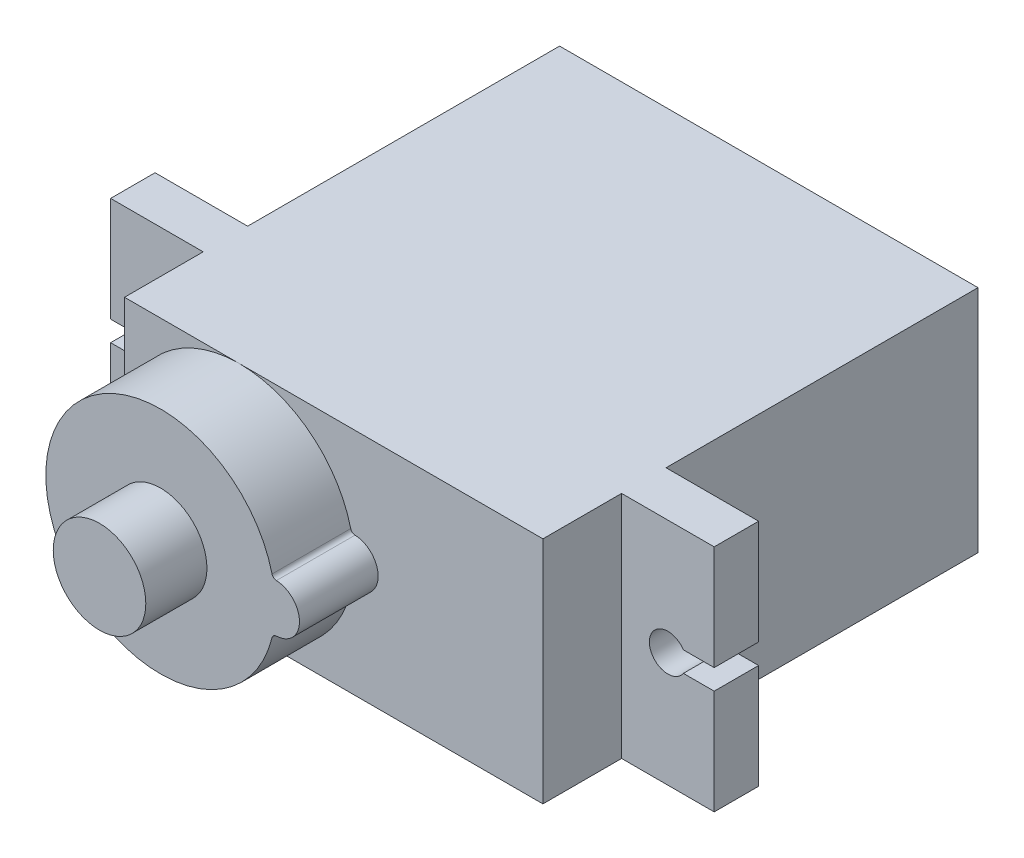
ISO-10303-21;
HEADER;
FILE_DESCRIPTION(('STEP AP214'),'2;1');
FILE_NAME('part.step','',(''),(''),'','','');
FILE_SCHEMA(('AUTOMOTIVE_DESIGN { 1 0 10303 214 1 1 1 1 }'));
ENDSEC;
DATA;
#1=APPLICATION_CONTEXT('core data for automotive mechanical design processes');
#2=APPLICATION_PROTOCOL_DEFINITION('international standard','automotive_design',2000,#1);
#3=PRODUCT_CONTEXT('',#1,'mechanical');
#4=PRODUCT('Part','Part','',(#3));
#5=PRODUCT_RELATED_PRODUCT_CATEGORY('part','',(#4));
#6=PRODUCT_DEFINITION_FORMATION('','',#4);
#7=PRODUCT_DEFINITION_CONTEXT('part definition',#1,'design');
#8=PRODUCT_DEFINITION('design','',#6,#7);
#9=PRODUCT_DEFINITION_SHAPE('','',#8);
#10=(LENGTH_UNIT() NAMED_UNIT(*) SI_UNIT(.MILLI.,.METRE.));
#11=(NAMED_UNIT(*) PLANE_ANGLE_UNIT() SI_UNIT($,.RADIAN.));
#12=(NAMED_UNIT(*) SI_UNIT($,.STERADIAN.) SOLID_ANGLE_UNIT());
#13=UNCERTAINTY_MEASURE_WITH_UNIT(LENGTH_MEASURE(1.E-05),#10,'distance_accuracy_value','');
#14=(GEOMETRIC_REPRESENTATION_CONTEXT(3) GLOBAL_UNCERTAINTY_ASSIGNED_CONTEXT((#13)) GLOBAL_UNIT_ASSIGNED_CONTEXT((#10,
#11,#12)) REPRESENTATION_CONTEXT('',''));
#15=CARTESIAN_POINT('',(0.,0.,0.));
#16=DIRECTION('',(0.,0.,1.));
#17=DIRECTION('',(1.,0.,0.));
#18=AXIS2_PLACEMENT_3D('',#15,#16,#17);
#19=CARTESIAN_POINT('',(0.,0.,23.5));
#20=DIRECTION('',(0.,0.,1.));
#21=DIRECTION('',(1.,0.,0.));
#22=AXIS2_PLACEMENT_3D('',#19,#20,#21);
#23=PLANE('',#22);
#24=CARTESIAN_POINT('',(1.16129032258064,1.54878775058365,23.5));
#25=DIRECTION('',(0.,0.,-1.));
#26=DIRECTION('',(-1.,0.,0.));
#27=AXIS2_PLACEMENT_3D('',#24,#25,#26);
#28=CIRCLE('',#27,0.25);
#29=CARTESIAN_POINT('',(1.15140478668054,1.29898327468306,23.5));
#30=VERTEX_POINT('',#29);
#31=CARTESIAN_POINT('',(0.918604651162786,1.48875721761529,23.5));
#32=VERTEX_POINT('',#31);
#33=EDGE_CURVE('E58',#30,#32,#28,.T.);
#34=ORIENTED_EDGE('',*,*,#33,.F.);
#35=CARTESIAN_POINT('',(1.1,0.,23.5));
#36=DIRECTION('',(0.,0.,1.));
#37=DIRECTION('',(1.,0.,0.));
#38=AXIS2_PLACEMENT_3D('',#35,#36,#37);
#39=CIRCLE('',#38,1.3);
#40=CARTESIAN_POINT('',(1.15140478668054,-1.29898327468306,23.5));
#41=VERTEX_POINT('',#40);
#42=EDGE_CURVE('E63',#41,#30,#39,.T.);
#43=ORIENTED_EDGE('',*,*,#42,.F.);
#44=CARTESIAN_POINT('',(1.16129032258064,-1.54878775058365,23.5));
#45=DIRECTION('',(0.,0.,1.));
#46=DIRECTION('',(1.,0.,0.));
#47=AXIS2_PLACEMENT_3D('',#44,#45,#46);
#48=CIRCLE('',#47,0.25);
#49=CARTESIAN_POINT('',(0.918604651162786,-1.48875721761529,23.5));
#50=VERTEX_POINT('',#49);
#51=EDGE_CURVE('E398',#41,#50,#48,.T.);
#52=ORIENTED_EDGE('',*,*,#51,.T.);
#53=CARTESIAN_POINT('',(-5.1,0.,23.5));
#54=DIRECTION('',(0.,0.,1.));
#55=DIRECTION('',(1.,0.,0.));
#56=AXIS2_PLACEMENT_3D('',#53,#54,#55);
#57=CIRCLE('',#56,6.2);
#58=CARTESIAN_POINT('',(-5.1,-6.2,23.5));
#59=VERTEX_POINT('',#58);
#60=EDGE_CURVE('E384',#59,#50,#57,.T.);
#61=ORIENTED_EDGE('',*,*,#60,.F.);
#62=DIRECTION('',(1.,0.,0.));
#63=VECTOR('',#62,1.);
#64=CARTESIAN_POINT('',(11.3,-6.2,23.5));
#65=LINE('',#64,#63);
#66=CARTESIAN_POINT('',(11.3,-6.2,23.5));
#67=VERTEX_POINT('',#66);
#68=EDGE_CURVE('E342',#59,#67,#65,.T.);
#69=ORIENTED_EDGE('',*,*,#68,.T.);
#70=DIRECTION('',(0.,1.,0.));
#71=VECTOR('',#70,1.);
#72=CARTESIAN_POINT('',(11.3,-6.2,23.5));
#73=LINE('',#72,#71);
#74=CARTESIAN_POINT('',(11.3,6.2,23.5));
#75=VERTEX_POINT('',#74);
#76=EDGE_CURVE('E349',#67,#75,#73,.T.);
#77=ORIENTED_EDGE('',*,*,#76,.T.);
#78=DIRECTION('',(-1.,0.,0.));
#79=VECTOR('',#78,1.);
#80=CARTESIAN_POINT('',(11.3,6.2,23.5));
#81=LINE('',#80,#79);
#82=CARTESIAN_POINT('',(-5.1,6.2,23.5));
#83=VERTEX_POINT('',#82);
#84=EDGE_CURVE('E355',#75,#83,#81,.T.);
#85=ORIENTED_EDGE('',*,*,#84,.T.);
#86=EDGE_CURVE('E395',#32,#83,#57,.T.);
#87=ORIENTED_EDGE('',*,*,#86,.F.);
#88=EDGE_LOOP('',(#34,#43,#52,#61,#69,#77,#85,#87));
#89=FACE_BOUND('',#88,.T.);
#90=ADVANCED_FACE('F44',(#89),#23,.T.);
#91=CARTESIAN_POINT('',(-11.3,0.,23.5));
#92=VERTEX_POINT('',#91);
#93=EDGE_CURVE('E52',#83,#92,#57,.T.);
#94=ORIENTED_EDGE('',*,*,#93,.F.);
#95=CARTESIAN_POINT('',(-11.3,6.2,23.5));
#96=VERTEX_POINT('',#95);
#97=EDGE_CURVE('E351',#83,#96,#81,.T.);
#98=ORIENTED_EDGE('',*,*,#97,.T.);
#99=DIRECTION('',(0.,-1.,0.));
#100=VECTOR('',#99,1.);
#101=CARTESIAN_POINT('',(-11.3,-6.2,23.5));
#102=LINE('',#101,#100);
#103=EDGE_CURVE('E343',#96,#92,#102,.T.);
#104=ORIENTED_EDGE('',*,*,#103,.T.);
#105=EDGE_LOOP('',(#94,#98,#104));
#106=FACE_BOUND('',#105,.T.);
#107=ADVANCED_FACE('F402',(#106),#23,.T.);
#108=CARTESIAN_POINT('',(16.3,11.7461698495448,16.85));
#109=DIRECTION('',(1.,0.,0.));
#110=DIRECTION('',(0.,1.,0.));
#111=AXIS2_PLACEMENT_3D('',#108,#109,#110);
#112=PLANE('',#111);
#113=DIRECTION('',(0.,0.,1.));
#114=VECTOR('',#113,1.);
#115=CARTESIAN_POINT('',(16.3,0.55,0.));
#116=LINE('',#115,#114);
#117=CARTESIAN_POINT('',(16.3,0.55,16.85));
#118=VERTEX_POINT('',#117);
#119=CARTESIAN_POINT('',(16.3,0.55,19.25));
#120=VERTEX_POINT('',#119);
#121=EDGE_CURVE('E258',#118,#120,#116,.T.);
#122=ORIENTED_EDGE('',*,*,#121,.F.);
#123=DIRECTION('',(0.,-1.,0.));
#124=VECTOR('',#123,1.);
#125=CARTESIAN_POINT('',(16.3,11.7461698495448,16.85));
#126=LINE('',#125,#124);
#127=CARTESIAN_POINT('',(16.3,6.2,16.85));
#128=VERTEX_POINT('',#127);
#129=EDGE_CURVE('E334',#128,#118,#126,.T.);
#130=ORIENTED_EDGE('',*,*,#129,.F.);
#131=DIRECTION('',(0.,0.,-1.));
#132=VECTOR('',#131,1.);
#133=CARTESIAN_POINT('',(16.3,6.2,16.85));
#134=LINE('',#133,#132);
#135=CARTESIAN_POINT('',(16.3,6.2,19.25));
#136=VERTEX_POINT('',#135);
#137=EDGE_CURVE('E315',#136,#128,#134,.T.);
#138=ORIENTED_EDGE('',*,*,#137,.F.);
#139=DIRECTION('',(0.,-1.,0.));
#140=VECTOR('',#139,1.);
#141=CARTESIAN_POINT('',(16.3,11.7461698495448,19.25));
#142=LINE('',#141,#140);
#143=EDGE_CURVE('E328',#136,#120,#142,.T.);
#144=ORIENTED_EDGE('',*,*,#143,.T.);
#145=EDGE_LOOP('',(#122,#130,#138,#144));
#146=FACE_BOUND('',#145,.T.);
#147=ADVANCED_FACE('F425',(#146),#112,.T.);
#148=CARTESIAN_POINT('',(-16.3,11.7461698495448,16.85));
#149=DIRECTION('',(-1.,0.,0.));
#150=DIRECTION('',(0.,-1.,0.));
#151=AXIS2_PLACEMENT_3D('',#148,#149,#150);
#152=PLANE('',#151);
#153=DIRECTION('',(0.,0.,1.));
#154=VECTOR('',#153,1.);
#155=CARTESIAN_POINT('',(-16.3,0.55,0.));
#156=LINE('',#155,#154);
#157=CARTESIAN_POINT('',(-16.3,0.55,16.85));
#158=VERTEX_POINT('',#157);
#159=CARTESIAN_POINT('',(-16.3,0.55,19.25));
#160=VERTEX_POINT('',#159);
#161=EDGE_CURVE('E249',#158,#160,#156,.T.);
#162=ORIENTED_EDGE('',*,*,#161,.T.);
#163=DIRECTION('',(0.,-1.,0.));
#164=VECTOR('',#163,1.);
#165=CARTESIAN_POINT('',(-16.3,11.7461698495448,19.25));
#166=LINE('',#165,#164);
#167=CARTESIAN_POINT('',(-16.3,6.2,19.25));
#168=VERTEX_POINT('',#167);
#169=EDGE_CURVE('E302',#168,#160,#166,.T.);
#170=ORIENTED_EDGE('',*,*,#169,.F.);
#171=DIRECTION('',(0.,0.,1.));
#172=VECTOR('',#171,1.);
#173=CARTESIAN_POINT('',(-16.3,6.2,16.85));
#174=LINE('',#173,#172);
#175=CARTESIAN_POINT('',(-16.3,6.2,16.85));
#176=VERTEX_POINT('',#175);
#177=EDGE_CURVE('E282',#176,#168,#174,.T.);
#178=ORIENTED_EDGE('',*,*,#177,.F.);
#179=DIRECTION('',(0.,-1.,0.));
#180=VECTOR('',#179,1.);
#181=CARTESIAN_POINT('',(-16.3,11.7461698495448,16.85));
#182=LINE('',#181,#180);
#183=EDGE_CURVE('E299',#176,#158,#182,.T.);
#184=ORIENTED_EDGE('',*,*,#183,.T.);
#185=EDGE_LOOP('',(#162,#170,#178,#184));
#186=FACE_BOUND('',#185,.T.);
#187=ADVANCED_FACE('F453',(#186),#152,.T.);
#188=CARTESIAN_POINT('',(-11.3,-6.2,23.5));
#189=DIRECTION('',(1.,0.,0.));
#190=DIRECTION('',(0.,0.,-1.));
#191=AXIS2_PLACEMENT_3D('',#188,#189,#190);
#192=PLANE('',#191);
#193=DIRECTION('',(0.,-1.,0.));
#194=VECTOR('',#193,1.);
#195=CARTESIAN_POINT('',(-11.3,11.7461698495448,16.85));
#196=LINE('',#195,#194);
#197=CARTESIAN_POINT('',(-11.3,6.2,16.85));
#198=VERTEX_POINT('',#197);
#199=CARTESIAN_POINT('',(-11.3,-6.2,16.85));
#200=VERTEX_POINT('',#199);
#201=EDGE_CURVE('E288',#198,#200,#196,.T.);
#202=ORIENTED_EDGE('',*,*,#201,.F.);
#203=DIRECTION('',(0.,0.,-1.));
#204=VECTOR('',#203,1.);
#205=CARTESIAN_POINT('',(-11.3,6.2,23.5));
#206=LINE('',#205,#204);
#207=CARTESIAN_POINT('',(-11.3,6.2,0.));
#208=VERTEX_POINT('',#207);
#209=EDGE_CURVE('E354',#198,#208,#206,.T.);
#210=ORIENTED_EDGE('',*,*,#209,.T.);
#211=DIRECTION('',(0.,-1.,0.));
#212=VECTOR('',#211,1.);
#213=CARTESIAN_POINT('',(-11.3,-6.2,0.));
#214=LINE('',#213,#212);
#215=CARTESIAN_POINT('',(-11.3,-6.2,0.));
#216=VERTEX_POINT('',#215);
#217=EDGE_CURVE('E339',#208,#216,#214,.T.);
#218=ORIENTED_EDGE('',*,*,#217,.T.);
#219=DIRECTION('',(0.,0.,-1.));
#220=VECTOR('',#219,1.);
#221=CARTESIAN_POINT('',(-11.3,-6.2,23.5));
#222=LINE('',#221,#220);
#223=EDGE_CURVE('E376',#200,#216,#222,.T.);
#224=ORIENTED_EDGE('',*,*,#223,.F.);
#225=EDGE_LOOP('',(#202,#210,#218,#224));
#226=FACE_BOUND('',#225,.T.);
#227=ADVANCED_FACE('F488',(#226),#192,.F.);
#228=CARTESIAN_POINT('',(11.3,-6.2,23.5));
#229=DIRECTION('',(-1.,0.,0.));
#230=DIRECTION('',(0.,0.,1.));
#231=AXIS2_PLACEMENT_3D('',#228,#229,#230);
#232=PLANE('',#231);
#233=DIRECTION('',(0.,-1.,0.));
#234=VECTOR('',#233,1.);
#235=CARTESIAN_POINT('',(11.3,11.7461698495448,19.25));
#236=LINE('',#235,#234);
#237=CARTESIAN_POINT('',(11.3,6.2,19.25));
#238=VERTEX_POINT('',#237);
#239=CARTESIAN_POINT('',(11.3,-6.2,19.25));
#240=VERTEX_POINT('',#239);
#241=EDGE_CURVE('E312',#238,#240,#236,.T.);
#242=ORIENTED_EDGE('',*,*,#241,.F.);
#243=DIRECTION('',(0.,0.,-1.));
#244=VECTOR('',#243,1.);
#245=CARTESIAN_POINT('',(11.3,6.2,23.5));
#246=LINE('',#245,#244);
#247=EDGE_CURVE('E367',#75,#238,#246,.T.);
#248=ORIENTED_EDGE('',*,*,#247,.F.);
#249=ORIENTED_EDGE('',*,*,#76,.F.);
#250=DIRECTION('',(0.,0.,-1.));
#251=VECTOR('',#250,1.);
#252=CARTESIAN_POINT('',(11.3,-6.2,23.5));
#253=LINE('',#252,#251);
#254=EDGE_CURVE('E372',#67,#240,#253,.T.);
#255=ORIENTED_EDGE('',*,*,#254,.T.);
#256=EDGE_LOOP('',(#242,#248,#249,#255));
#257=FACE_BOUND('',#256,.T.);
#258=ADVANCED_FACE('F415',(#257),#232,.F.);
#259=CARTESIAN_POINT('',(-11.3,6.2,19.25));
#260=VERTEX_POINT('',#259);
#261=EDGE_CURVE('E370',#96,#260,#206,.T.);
#262=ORIENTED_EDGE('',*,*,#261,.T.);
#263=DIRECTION('',(0.,-1.,0.));
#264=VECTOR('',#263,1.);
#265=CARTESIAN_POINT('',(-11.3,11.7461698495448,19.25));
#266=LINE('',#265,#264);
#267=CARTESIAN_POINT('',(-11.3,-6.2,19.25));
#268=VERTEX_POINT('',#267);
#269=EDGE_CURVE('E300',#260,#268,#266,.T.);
#270=ORIENTED_EDGE('',*,*,#269,.T.);
#271=CARTESIAN_POINT('',(-11.3,-6.2,23.5));
#272=VERTEX_POINT('',#271);
#273=EDGE_CURVE('E380',#272,#268,#222,.T.);
#274=ORIENTED_EDGE('',*,*,#273,.F.);
#275=EDGE_CURVE('E344',#92,#272,#102,.T.);
#276=ORIENTED_EDGE('',*,*,#275,.F.);
#277=ORIENTED_EDGE('',*,*,#103,.F.);
#278=EDGE_LOOP('',(#262,#270,#274,#276,#277));
#279=FACE_BOUND('',#278,.T.);
#280=ADVANCED_FACE('F50',(#279),#192,.F.);
#281=CARTESIAN_POINT('',(11.3,-6.2,23.5));
#282=DIRECTION('',(0.,1.,0.));
#283=DIRECTION('',(-1.,0.,0.));
#284=AXIS2_PLACEMENT_3D('',#281,#282,#283);
#285=PLANE('',#284);
#286=DIRECTION('',(1.,0.,0.));
#287=VECTOR('',#286,1.);
#288=CARTESIAN_POINT('',(11.3,-6.2,0.));
#289=LINE('',#288,#287);
#290=CARTESIAN_POINT('',(11.3,-6.2,0.));
#291=VERTEX_POINT('',#290);
#292=EDGE_CURVE('E356',#216,#291,#289,.T.);
#293=ORIENTED_EDGE('',*,*,#292,.T.);
#294=CARTESIAN_POINT('',(11.3,-6.2,16.85));
#295=VERTEX_POINT('',#294);
#296=EDGE_CURVE('E373',#295,#291,#253,.T.);
#297=ORIENTED_EDGE('',*,*,#296,.F.);
#298=DIRECTION('',(1.,0.,0.));
#299=VECTOR('',#298,1.);
#300=CARTESIAN_POINT('',(11.3,-6.2,16.85));
#301=LINE('',#300,#299);
#302=CARTESIAN_POINT('',(16.3,-6.2,16.85));
#303=VERTEX_POINT('',#302);
#304=EDGE_CURVE('E313',#295,#303,#301,.T.);
#305=ORIENTED_EDGE('',*,*,#304,.T.);
#306=DIRECTION('',(0.,0.,1.));
#307=VECTOR('',#306,1.);
#308=CARTESIAN_POINT('',(16.3,-6.2,16.85));
#309=LINE('',#308,#307);
#310=CARTESIAN_POINT('',(16.3,-6.2,19.25));
#311=VERTEX_POINT('',#310);
#312=EDGE_CURVE('E319',#303,#311,#309,.T.);
#313=ORIENTED_EDGE('',*,*,#312,.T.);
#314=DIRECTION('',(-1.,0.,0.));
#315=VECTOR('',#314,1.);
#316=CARTESIAN_POINT('',(11.3,-6.2,19.25));
#317=LINE('',#316,#315);
#318=EDGE_CURVE('E323',#311,#240,#317,.T.);
#319=ORIENTED_EDGE('',*,*,#318,.T.);
#320=ORIENTED_EDGE('',*,*,#254,.F.);
#321=ORIENTED_EDGE('',*,*,#68,.F.);
#322=EDGE_CURVE('E347',#272,#59,#65,.T.);
#323=ORIENTED_EDGE('',*,*,#322,.F.);
#324=ORIENTED_EDGE('',*,*,#273,.T.);
#325=DIRECTION('',(-1.,0.,0.));
#326=VECTOR('',#325,1.);
#327=CARTESIAN_POINT('',(-11.3,-6.2,19.25));
#328=LINE('',#327,#326);
#329=CARTESIAN_POINT('',(-16.3,-6.2,19.25));
#330=VERTEX_POINT('',#329);
#331=EDGE_CURVE('E285',#268,#330,#328,.T.);
#332=ORIENTED_EDGE('',*,*,#331,.T.);
#333=DIRECTION('',(0.,0.,-1.));
#334=VECTOR('',#333,1.);
#335=CARTESIAN_POINT('',(-16.3,-6.2,16.85));
#336=LINE('',#335,#334);
#337=CARTESIAN_POINT('',(-16.3,-6.2,16.85));
#338=VERTEX_POINT('',#337);
#339=EDGE_CURVE('E292',#330,#338,#336,.T.);
#340=ORIENTED_EDGE('',*,*,#339,.T.);
#341=DIRECTION('',(1.,0.,0.));
#342=VECTOR('',#341,1.);
#343=CARTESIAN_POINT('',(-11.3,-6.2,16.85));
#344=LINE('',#343,#342);
#345=EDGE_CURVE('E294',#338,#200,#344,.T.);
#346=ORIENTED_EDGE('',*,*,#345,.T.);
#347=ORIENTED_EDGE('',*,*,#223,.T.);
#348=EDGE_LOOP('',(#293,#297,#305,#313,#319,#320,#321,#323,#324,#332,#340,#346,#347));
#349=FACE_BOUND('',#348,.T.);
#350=ADVANCED_FACE('F433',(#349),#285,.F.);
#351=CARTESIAN_POINT('',(11.3,6.2,16.85));
#352=VERTEX_POINT('',#351);
#353=CARTESIAN_POINT('',(11.3,6.2,0.));
#354=VERTEX_POINT('',#353);
#355=EDGE_CURVE('E369',#352,#354,#246,.T.);
#356=ORIENTED_EDGE('',*,*,#355,.F.);
#357=DIRECTION('',(0.,-1.,0.));
#358=VECTOR('',#357,1.);
#359=CARTESIAN_POINT('',(11.3,11.7461698495448,16.85));
#360=LINE('',#359,#358);
#361=EDGE_CURVE('E326',#352,#295,#360,.T.);
#362=ORIENTED_EDGE('',*,*,#361,.T.);
#363=ORIENTED_EDGE('',*,*,#296,.T.);
#364=DIRECTION('',(0.,1.,0.));
#365=VECTOR('',#364,1.);
#366=CARTESIAN_POINT('',(11.3,-6.2,0.));
#367=LINE('',#366,#365);
#368=EDGE_CURVE('E363',#291,#354,#367,.T.);
#369=ORIENTED_EDGE('',*,*,#368,.T.);
#370=EDGE_LOOP('',(#356,#362,#363,#369));
#371=FACE_BOUND('',#370,.T.);
#372=ADVANCED_FACE('F431',(#371),#232,.F.);
#373=CARTESIAN_POINT('',(11.3,6.2,23.5));
#374=DIRECTION('',(0.,-1.,0.));
#375=DIRECTION('',(1.,0.,0.));
#376=AXIS2_PLACEMENT_3D('',#373,#374,#375);
#377=PLANE('',#376);
#378=DIRECTION('',(-1.,0.,0.));
#379=VECTOR('',#378,1.);
#380=CARTESIAN_POINT('',(11.3,6.2,0.));
#381=LINE('',#380,#379);
#382=EDGE_CURVE('E365',#354,#208,#381,.T.);
#383=ORIENTED_EDGE('',*,*,#382,.T.);
#384=ORIENTED_EDGE('',*,*,#209,.F.);
#385=DIRECTION('',(-1.,0.,0.));
#386=VECTOR('',#385,1.);
#387=CARTESIAN_POINT('',(-11.3,6.2,16.85));
#388=LINE('',#387,#386);
#389=EDGE_CURVE('E284',#198,#176,#388,.T.);
#390=ORIENTED_EDGE('',*,*,#389,.T.);
#391=ORIENTED_EDGE('',*,*,#177,.T.);
#392=DIRECTION('',(1.,0.,0.));
#393=VECTOR('',#392,1.);
#394=CARTESIAN_POINT('',(-11.3,6.2,19.25));
#395=LINE('',#394,#393);
#396=EDGE_CURVE('E286',#168,#260,#395,.T.);
#397=ORIENTED_EDGE('',*,*,#396,.T.);
#398=ORIENTED_EDGE('',*,*,#261,.F.);
#399=ORIENTED_EDGE('',*,*,#97,.F.);
#400=ORIENTED_EDGE('',*,*,#84,.F.);
#401=ORIENTED_EDGE('',*,*,#247,.T.);
#402=DIRECTION('',(1.,0.,0.));
#403=VECTOR('',#402,1.);
#404=CARTESIAN_POINT('',(11.3,6.2,19.25));
#405=LINE('',#404,#403);
#406=EDGE_CURVE('E314',#238,#136,#405,.T.);
#407=ORIENTED_EDGE('',*,*,#406,.T.);
#408=ORIENTED_EDGE('',*,*,#137,.T.);
#409=DIRECTION('',(-1.,0.,0.));
#410=VECTOR('',#409,1.);
#411=CARTESIAN_POINT('',(11.3,6.2,16.85));
#412=LINE('',#411,#410);
#413=EDGE_CURVE('E320',#128,#352,#412,.T.);
#414=ORIENTED_EDGE('',*,*,#413,.T.);
#415=ORIENTED_EDGE('',*,*,#355,.T.);
#416=EDGE_LOOP('',(#383,#384,#390,#391,#397,#398,#399,#400,#401,#407,#408,#414,#415));
#417=FACE_BOUND('',#416,.T.);
#418=ADVANCED_FACE('F406',(#417),#377,.F.);
#419=EDGE_CURVE('E388',#92,#59,#57,.T.);
#420=ORIENTED_EDGE('',*,*,#419,.F.);
#421=ORIENTED_EDGE('',*,*,#275,.T.);
#422=ORIENTED_EDGE('',*,*,#322,.T.);
#423=EDGE_LOOP('',(#420,#421,#422));
#424=FACE_BOUND('',#423,.T.);
#425=ADVANCED_FACE('F463',(#424),#23,.T.);
#426=CARTESIAN_POINT('',(0.,0.,0.));
#427=DIRECTION('',(0.,0.,1.));
#428=DIRECTION('',(1.,0.,0.));
#429=AXIS2_PLACEMENT_3D('',#426,#427,#428);
#430=PLANE('',#429);
#431=ORIENTED_EDGE('',*,*,#217,.F.);
#432=ORIENTED_EDGE('',*,*,#382,.F.);
#433=ORIENTED_EDGE('',*,*,#368,.F.);
#434=ORIENTED_EDGE('',*,*,#292,.F.);
#435=EDGE_LOOP('',(#431,#432,#433,#434));
#436=FACE_BOUND('',#435,.T.);
#437=ADVANCED_FACE('F438',(#436),#430,.F.);
#438=CARTESIAN_POINT('',(11.3,11.7461698495448,19.25));
#439=DIRECTION('',(0.,0.,1.));
#440=DIRECTION('',(1.,0.,0.));
#441=AXIS2_PLACEMENT_3D('',#438,#439,#440);
#442=PLANE('',#441);
#443=DIRECTION('',(-1.,0.,0.));
#444=VECTOR('',#443,1.);
#445=CARTESIAN_POINT('',(16.3,0.55,19.25));
#446=LINE('',#445,#444);
#447=CARTESIAN_POINT('',(14.6351646544245,0.55,19.25));
#448=VERTEX_POINT('',#447);
#449=EDGE_CURVE('E248',#120,#448,#446,.T.);
#450=ORIENTED_EDGE('',*,*,#449,.F.);
#451=ORIENTED_EDGE('',*,*,#143,.F.);
#452=ORIENTED_EDGE('',*,*,#406,.F.);
#453=ORIENTED_EDGE('',*,*,#241,.T.);
#454=ORIENTED_EDGE('',*,*,#318,.F.);
#455=CARTESIAN_POINT('',(16.3,-0.55,19.25));
#456=VERTEX_POINT('',#455);
#457=EDGE_CURVE('E335',#456,#311,#142,.T.);
#458=ORIENTED_EDGE('',*,*,#457,.F.);
#459=DIRECTION('',(1.,0.,0.));
#460=VECTOR('',#459,1.);
#461=CARTESIAN_POINT('',(16.3,-0.55,19.25));
#462=LINE('',#461,#460);
#463=CARTESIAN_POINT('',(14.6351646544245,-0.55,19.25));
#464=VERTEX_POINT('',#463);
#465=EDGE_CURVE('E251',#464,#456,#462,.T.);
#466=ORIENTED_EDGE('',*,*,#465,.F.);
#467=CARTESIAN_POINT('',(13.8,0.,19.25));
#468=DIRECTION('',(0.,0.,1.));
#469=DIRECTION('',(-1.,0.,0.));
#470=AXIS2_PLACEMENT_3D('',#467,#468,#469);
#471=CIRCLE('',#470,0.999999999999997);
#472=EDGE_CURVE('E247',#448,#464,#471,.T.);
#473=ORIENTED_EDGE('',*,*,#472,.F.);
#474=EDGE_LOOP('',(#450,#451,#452,#453,#454,#458,#466,#473));
#475=FACE_BOUND('',#474,.T.);
#476=ADVANCED_FACE('F416',(#475),#442,.T.);
#477=DIRECTION('',(0.,0.,1.));
#478=VECTOR('',#477,1.);
#479=CARTESIAN_POINT('',(16.3,-0.55,0.));
#480=LINE('',#479,#478);
#481=CARTESIAN_POINT('',(16.3,-0.55,16.85));
#482=VERTEX_POINT('',#481);
#483=EDGE_CURVE('E259',#482,#456,#480,.T.);
#484=ORIENTED_EDGE('',*,*,#483,.T.);
#485=ORIENTED_EDGE('',*,*,#457,.T.);
#486=ORIENTED_EDGE('',*,*,#312,.F.);
#487=EDGE_CURVE('E336',#482,#303,#126,.T.);
#488=ORIENTED_EDGE('',*,*,#487,.F.);
#489=EDGE_LOOP('',(#484,#485,#486,#488));
#490=FACE_BOUND('',#489,.T.);
#491=ADVANCED_FACE('F483',(#490),#112,.T.);
#492=CARTESIAN_POINT('',(11.3,11.7461698495448,16.85));
#493=DIRECTION('',(0.,0.,-1.));
#494=DIRECTION('',(-1.,0.,0.));
#495=AXIS2_PLACEMENT_3D('',#492,#493,#494);
#496=PLANE('',#495);
#497=DIRECTION('',(1.,0.,0.));
#498=VECTOR('',#497,1.);
#499=CARTESIAN_POINT('',(11.3,0.55,16.85));
#500=LINE('',#499,#498);
#501=CARTESIAN_POINT('',(14.6351646544245,0.55,16.85));
#502=VERTEX_POINT('',#501);
#503=EDGE_CURVE('E383',#502,#118,#500,.T.);
#504=ORIENTED_EDGE('',*,*,#503,.F.);
#505=CARTESIAN_POINT('',(13.8,0.,16.85));
#506=DIRECTION('',(0.,0.,-1.));
#507=DIRECTION('',(-1.,0.,0.));
#508=AXIS2_PLACEMENT_3D('',#505,#506,#507);
#509=CIRCLE('',#508,0.999999999999997);
#510=CARTESIAN_POINT('',(14.6351646544245,-0.55,16.85));
#511=VERTEX_POINT('',#510);
#512=EDGE_CURVE('E379',#511,#502,#509,.T.);
#513=ORIENTED_EDGE('',*,*,#512,.F.);
#514=DIRECTION('',(-1.,0.,0.));
#515=VECTOR('',#514,1.);
#516=CARTESIAN_POINT('',(11.3,-0.55,16.85));
#517=LINE('',#516,#515);
#518=EDGE_CURVE('E385',#482,#511,#517,.T.);
#519=ORIENTED_EDGE('',*,*,#518,.F.);
#520=ORIENTED_EDGE('',*,*,#487,.T.);
#521=ORIENTED_EDGE('',*,*,#304,.F.);
#522=ORIENTED_EDGE('',*,*,#361,.F.);
#523=ORIENTED_EDGE('',*,*,#413,.F.);
#524=ORIENTED_EDGE('',*,*,#129,.T.);
#525=EDGE_LOOP('',(#504,#513,#519,#520,#521,#522,#523,#524));
#526=FACE_BOUND('',#525,.T.);
#527=ADVANCED_FACE('F428',(#526),#496,.T.);
#528=CARTESIAN_POINT('',(-11.3,11.7461698495448,16.85));
#529=DIRECTION('',(0.,0.,-1.));
#530=DIRECTION('',(-1.,0.,0.));
#531=AXIS2_PLACEMENT_3D('',#528,#529,#530);
#532=PLANE('',#531);
#533=DIRECTION('',(1.,0.,0.));
#534=VECTOR('',#533,1.);
#535=CARTESIAN_POINT('',(-11.3,0.55,16.85));
#536=LINE('',#535,#534);
#537=CARTESIAN_POINT('',(-14.6351646544245,0.55,16.85));
#538=VERTEX_POINT('',#537);
#539=EDGE_CURVE('E278',#158,#538,#536,.T.);
#540=ORIENTED_EDGE('',*,*,#539,.F.);
#541=ORIENTED_EDGE('',*,*,#183,.F.);
#542=ORIENTED_EDGE('',*,*,#389,.F.);
#543=ORIENTED_EDGE('',*,*,#201,.T.);
#544=ORIENTED_EDGE('',*,*,#345,.F.);
#545=CARTESIAN_POINT('',(-16.3,-0.55,16.85));
#546=VERTEX_POINT('',#545);
#547=EDGE_CURVE('E301',#546,#338,#182,.T.);
#548=ORIENTED_EDGE('',*,*,#547,.F.);
#549=DIRECTION('',(-1.,0.,0.));
#550=VECTOR('',#549,1.);
#551=CARTESIAN_POINT('',(-11.3,-0.55,16.85));
#552=LINE('',#551,#550);
#553=CARTESIAN_POINT('',(-14.6351646544245,-0.55,16.85));
#554=VERTEX_POINT('',#553);
#555=EDGE_CURVE('E256',#554,#546,#552,.T.);
#556=ORIENTED_EDGE('',*,*,#555,.F.);
#557=CARTESIAN_POINT('',(-13.8,0.,16.85));
#558=DIRECTION('',(0.,0.,-1.));
#559=DIRECTION('',(-1.,0.,0.));
#560=AXIS2_PLACEMENT_3D('',#557,#558,#559);
#561=CIRCLE('',#560,0.999999999999997);
#562=EDGE_CURVE('E279',#538,#554,#561,.T.);
#563=ORIENTED_EDGE('',*,*,#562,.F.);
#564=EDGE_LOOP('',(#540,#541,#542,#543,#544,#548,#556,#563));
#565=FACE_BOUND('',#564,.T.);
#566=ADVANCED_FACE('F450',(#565),#532,.T.);
#567=DIRECTION('',(0.,0.,1.));
#568=VECTOR('',#567,1.);
#569=CARTESIAN_POINT('',(-16.3,-0.55,0.));
#570=LINE('',#569,#568);
#571=CARTESIAN_POINT('',(-16.3,-0.55,19.25));
#572=VERTEX_POINT('',#571);
#573=EDGE_CURVE('E267',#546,#572,#570,.T.);
#574=ORIENTED_EDGE('',*,*,#573,.F.);
#575=ORIENTED_EDGE('',*,*,#547,.T.);
#576=ORIENTED_EDGE('',*,*,#339,.F.);
#577=EDGE_CURVE('E307',#572,#330,#166,.T.);
#578=ORIENTED_EDGE('',*,*,#577,.F.);
#579=EDGE_LOOP('',(#574,#575,#576,#578));
#580=FACE_BOUND('',#579,.T.);
#581=ADVANCED_FACE('F489',(#580),#152,.T.);
#582=CARTESIAN_POINT('',(-11.3,11.7461698495448,19.25));
#583=DIRECTION('',(0.,0.,1.));
#584=DIRECTION('',(1.,0.,0.));
#585=AXIS2_PLACEMENT_3D('',#582,#583,#584);
#586=PLANE('',#585);
#587=DIRECTION('',(-1.,0.,0.));
#588=VECTOR('',#587,1.);
#589=CARTESIAN_POINT('',(-16.3,0.55,19.25));
#590=LINE('',#589,#588);
#591=CARTESIAN_POINT('',(-14.6351646544245,0.55,19.25));
#592=VERTEX_POINT('',#591);
#593=EDGE_CURVE('E270',#592,#160,#590,.T.);
#594=ORIENTED_EDGE('',*,*,#593,.F.);
#595=CARTESIAN_POINT('',(-13.8,0.,19.25));
#596=DIRECTION('',(0.,0.,1.));
#597=DIRECTION('',(1.,0.,0.));
#598=AXIS2_PLACEMENT_3D('',#595,#596,#597);
#599=CIRCLE('',#598,0.999999999999997);
#600=CARTESIAN_POINT('',(-14.6351646544245,-0.55,19.25));
#601=VERTEX_POINT('',#600);
#602=EDGE_CURVE('E238',#601,#592,#599,.T.);
#603=ORIENTED_EDGE('',*,*,#602,.F.);
#604=DIRECTION('',(1.,0.,0.));
#605=VECTOR('',#604,1.);
#606=CARTESIAN_POINT('',(-16.3,-0.55,19.25));
#607=LINE('',#606,#605);
#608=EDGE_CURVE('E240',#572,#601,#607,.T.);
#609=ORIENTED_EDGE('',*,*,#608,.F.);
#610=ORIENTED_EDGE('',*,*,#577,.T.);
#611=ORIENTED_EDGE('',*,*,#331,.F.);
#612=ORIENTED_EDGE('',*,*,#269,.F.);
#613=ORIENTED_EDGE('',*,*,#396,.F.);
#614=ORIENTED_EDGE('',*,*,#169,.T.);
#615=EDGE_LOOP('',(#594,#603,#609,#610,#611,#612,#613,#614));
#616=FACE_BOUND('',#615,.T.);
#617=ADVANCED_FACE('F456',(#616),#586,.T.);
#618=CARTESIAN_POINT('',(-16.3,0.55,0.));
#619=DIRECTION('',(0.,1.,0.));
#620=DIRECTION('',(0.,0.,1.));
#621=AXIS2_PLACEMENT_3D('',#618,#619,#620);
#622=PLANE('',#621);
#623=ORIENTED_EDGE('',*,*,#539,.T.);
#624=DIRECTION('',(0.,0.,1.));
#625=VECTOR('',#624,1.);
#626=CARTESIAN_POINT('',(-14.6351646544245,0.55,0.));
#627=LINE('',#626,#625);
#628=EDGE_CURVE('E275',#538,#592,#627,.T.);
#629=ORIENTED_EDGE('',*,*,#628,.T.);
#630=ORIENTED_EDGE('',*,*,#593,.T.);
#631=ORIENTED_EDGE('',*,*,#161,.F.);
#632=EDGE_LOOP('',(#623,#629,#630,#631));
#633=FACE_BOUND('',#632,.T.);
#634=ADVANCED_FACE('F522',(#633),#622,.F.);
#635=CARTESIAN_POINT('',(-13.8,0.,0.));
#636=DIRECTION('',(0.,0.,1.));
#637=DIRECTION('',(1.,0.,0.));
#638=AXIS2_PLACEMENT_3D('',#635,#636,#637);
#639=CYLINDRICAL_SURFACE('',#638,0.999999999999997);
#640=ORIENTED_EDGE('',*,*,#562,.T.);
#641=DIRECTION('',(0.,0.,1.));
#642=VECTOR('',#641,1.);
#643=CARTESIAN_POINT('',(-14.6351646544245,-0.55,0.));
#644=LINE('',#643,#642);
#645=EDGE_CURVE('E273',#554,#601,#644,.T.);
#646=ORIENTED_EDGE('',*,*,#645,.T.);
#647=ORIENTED_EDGE('',*,*,#602,.T.);
#648=ORIENTED_EDGE('',*,*,#628,.F.);
#649=EDGE_LOOP('',(#640,#646,#647,#648));
#650=FACE_BOUND('',#649,.T.);
#651=ADVANCED_FACE('F518',(#650),#639,.F.);
#652=CARTESIAN_POINT('',(-16.3,-0.55,0.));
#653=DIRECTION('',(0.,-1.,0.));
#654=DIRECTION('',(0.,0.,-1.));
#655=AXIS2_PLACEMENT_3D('',#652,#653,#654);
#656=PLANE('',#655);
#657=ORIENTED_EDGE('',*,*,#555,.T.);
#658=ORIENTED_EDGE('',*,*,#573,.T.);
#659=ORIENTED_EDGE('',*,*,#608,.T.);
#660=ORIENTED_EDGE('',*,*,#645,.F.);
#661=EDGE_LOOP('',(#657,#658,#659,#660));
#662=FACE_BOUND('',#661,.T.);
#663=ADVANCED_FACE('F509',(#662),#656,.F.);
#664=CARTESIAN_POINT('',(16.3,0.55,0.));
#665=DIRECTION('',(0.,1.,0.));
#666=DIRECTION('',(0.,0.,1.));
#667=AXIS2_PLACEMENT_3D('',#664,#665,#666);
#668=PLANE('',#667);
#669=ORIENTED_EDGE('',*,*,#503,.T.);
#670=ORIENTED_EDGE('',*,*,#121,.T.);
#671=ORIENTED_EDGE('',*,*,#449,.T.);
#672=DIRECTION('',(0.,0.,1.));
#673=VECTOR('',#672,1.);
#674=CARTESIAN_POINT('',(14.6351646544245,0.55,0.));
#675=LINE('',#674,#673);
#676=EDGE_CURVE('E254',#502,#448,#675,.T.);
#677=ORIENTED_EDGE('',*,*,#676,.F.);
#678=EDGE_LOOP('',(#669,#670,#671,#677));
#679=FACE_BOUND('',#678,.T.);
#680=ADVANCED_FACE('F506',(#679),#668,.F.);
#681=CARTESIAN_POINT('',(16.3,-0.55,0.));
#682=DIRECTION('',(0.,-1.,0.));
#683=DIRECTION('',(0.,0.,-1.));
#684=AXIS2_PLACEMENT_3D('',#681,#682,#683);
#685=PLANE('',#684);
#686=ORIENTED_EDGE('',*,*,#518,.T.);
#687=DIRECTION('',(0.,0.,1.));
#688=VECTOR('',#687,1.);
#689=CARTESIAN_POINT('',(14.6351646544245,-0.55,0.));
#690=LINE('',#689,#688);
#691=EDGE_CURVE('E265',#511,#464,#690,.T.);
#692=ORIENTED_EDGE('',*,*,#691,.T.);
#693=ORIENTED_EDGE('',*,*,#465,.T.);
#694=ORIENTED_EDGE('',*,*,#483,.F.);
#695=EDGE_LOOP('',(#686,#692,#693,#694));
#696=FACE_BOUND('',#695,.T.);
#697=ADVANCED_FACE('F503',(#696),#685,.F.);
#698=CARTESIAN_POINT('',(13.8,0.,0.));
#699=DIRECTION('',(0.,0.,1.));
#700=DIRECTION('',(1.,0.,0.));
#701=AXIS2_PLACEMENT_3D('',#698,#699,#700);
#702=CYLINDRICAL_SURFACE('',#701,0.999999999999997);
#703=ORIENTED_EDGE('',*,*,#512,.T.);
#704=ORIENTED_EDGE('',*,*,#676,.T.);
#705=ORIENTED_EDGE('',*,*,#472,.T.);
#706=ORIENTED_EDGE('',*,*,#691,.F.);
#707=EDGE_LOOP('',(#703,#704,#705,#706));
#708=FACE_BOUND('',#707,.T.);
#709=ADVANCED_FACE('F510',(#708),#702,.F.);
#710=CARTESIAN_POINT('',(1.16129032258064,1.54878775058365,27.75));
#711=DIRECTION('',(0.,0.,-1.));
#712=DIRECTION('',(-1.,0.,0.));
#713=AXIS2_PLACEMENT_3D('',#710,#711,#712);
#714=CYLINDRICAL_SURFACE('',#713,0.25);
#715=ORIENTED_EDGE('',*,*,#33,.T.);
#716=DIRECTION('',(0.,0.,-1.));
#717=VECTOR('',#716,1.);
#718=CARTESIAN_POINT('',(0.918604651162786,1.48875721761529,27.75));
#719=LINE('',#718,#717);
#720=CARTESIAN_POINT('',(0.918604651162786,1.48875721761529,27.75));
#721=VERTEX_POINT('',#720);
#722=EDGE_CURVE('E217',#721,#32,#719,.T.);
#723=ORIENTED_EDGE('',*,*,#722,.F.);
#724=CARTESIAN_POINT('',(1.16129032258064,1.54878775058365,27.75));
#725=DIRECTION('',(0.,0.,-1.));
#726=DIRECTION('',(-1.,0.,0.));
#727=AXIS2_PLACEMENT_3D('',#724,#725,#726);
#728=CIRCLE('',#727,0.25);
#729=CARTESIAN_POINT('',(1.15140478668054,1.29898327468306,27.75));
#730=VERTEX_POINT('',#729);
#731=EDGE_CURVE('E226',#730,#721,#728,.T.);
#732=ORIENTED_EDGE('',*,*,#731,.F.);
#733=DIRECTION('',(0.,0.,-1.));
#734=VECTOR('',#733,1.);
#735=CARTESIAN_POINT('',(1.15140478668054,1.29898327468306,27.75));
#736=LINE('',#735,#734);
#737=EDGE_CURVE('E873',#730,#30,#736,.T.);
#738=ORIENTED_EDGE('',*,*,#737,.T.);
#739=EDGE_LOOP('',(#715,#723,#732,#738));
#740=FACE_BOUND('',#739,.T.);
#741=ADVANCED_FACE('F237',(#740),#714,.F.);
#742=CARTESIAN_POINT('',(-5.1,0.,27.75));
#743=DIRECTION('',(0.,0.,-1.));
#744=DIRECTION('',(-1.,0.,0.));
#745=AXIS2_PLACEMENT_3D('',#742,#743,#744);
#746=CYLINDRICAL_SURFACE('',#745,6.2);
#747=ORIENTED_EDGE('',*,*,#86,.T.);
#748=ORIENTED_EDGE('',*,*,#93,.T.);
#749=ORIENTED_EDGE('',*,*,#419,.T.);
#750=ORIENTED_EDGE('',*,*,#60,.T.);
#751=DIRECTION('',(0.,0.,-1.));
#752=VECTOR('',#751,1.);
#753=CARTESIAN_POINT('',(0.918604651162786,-1.48875721761529,27.75));
#754=LINE('',#753,#752);
#755=CARTESIAN_POINT('',(0.918604651162786,-1.48875721761529,27.75));
#756=VERTEX_POINT('',#755);
#757=EDGE_CURVE('E222',#756,#50,#754,.T.);
#758=ORIENTED_EDGE('',*,*,#757,.F.);
#759=CARTESIAN_POINT('',(-5.1,0.,27.75));
#760=DIRECTION('',(0.,0.,1.));
#761=DIRECTION('',(1.,0.,0.));
#762=AXIS2_PLACEMENT_3D('',#759,#760,#761);
#763=CIRCLE('',#762,6.2);
#764=EDGE_CURVE('E213',#721,#756,#763,.T.);
#765=ORIENTED_EDGE('',*,*,#764,.F.);
#766=ORIENTED_EDGE('',*,*,#722,.T.);
#767=EDGE_LOOP('',(#747,#748,#749,#750,#758,#765,#766));
#768=FACE_BOUND('',#767,.T.);
#769=ADVANCED_FACE('F216',(#768),#746,.T.);
#770=CARTESIAN_POINT('',(1.16129032258064,-1.54878775058365,27.75));
#771=DIRECTION('',(0.,0.,-1.));
#772=DIRECTION('',(-1.,0.,0.));
#773=AXIS2_PLACEMENT_3D('',#770,#771,#772);
#774=CYLINDRICAL_SURFACE('',#773,0.25);
#775=ORIENTED_EDGE('',*,*,#51,.F.);
#776=DIRECTION('',(0.,0.,-1.));
#777=VECTOR('',#776,1.);
#778=CARTESIAN_POINT('',(1.15140478668054,-1.29898327468306,27.75));
#779=LINE('',#778,#777);
#780=CARTESIAN_POINT('',(1.15140478668054,-1.29898327468306,27.75));
#781=VERTEX_POINT('',#780);
#782=EDGE_CURVE('E245',#781,#41,#779,.T.);
#783=ORIENTED_EDGE('',*,*,#782,.F.);
#784=CARTESIAN_POINT('',(1.16129032258064,-1.54878775058365,27.75));
#785=DIRECTION('',(0.,0.,1.));
#786=DIRECTION('',(1.,0.,0.));
#787=AXIS2_PLACEMENT_3D('',#784,#785,#786);
#788=CIRCLE('',#787,0.25);
#789=EDGE_CURVE('E223',#781,#756,#788,.T.);
#790=ORIENTED_EDGE('',*,*,#789,.T.);
#791=ORIENTED_EDGE('',*,*,#757,.T.);
#792=EDGE_LOOP('',(#775,#783,#790,#791));
#793=FACE_BOUND('',#792,.T.);
#794=ADVANCED_FACE('F570',(#793),#774,.F.);
#795=CARTESIAN_POINT('',(1.1,0.,27.75));
#796=DIRECTION('',(0.,0.,-1.));
#797=DIRECTION('',(-1.,0.,0.));
#798=AXIS2_PLACEMENT_3D('',#795,#796,#797);
#799=CYLINDRICAL_SURFACE('',#798,1.3);
#800=ORIENTED_EDGE('',*,*,#42,.T.);
#801=ORIENTED_EDGE('',*,*,#737,.F.);
#802=CARTESIAN_POINT('',(1.1,0.,27.75));
#803=DIRECTION('',(0.,0.,1.));
#804=DIRECTION('',(1.,0.,0.));
#805=AXIS2_PLACEMENT_3D('',#802,#803,#804);
#806=CIRCLE('',#805,1.3);
#807=EDGE_CURVE('E233',#781,#730,#806,.T.);
#808=ORIENTED_EDGE('',*,*,#807,.F.);
#809=ORIENTED_EDGE('',*,*,#782,.T.);
#810=EDGE_LOOP('',(#800,#801,#808,#809));
#811=FACE_BOUND('',#810,.T.);
#812=ADVANCED_FACE('F580',(#811),#799,.T.);
#813=CARTESIAN_POINT('',(-1.96935483870968,0.774393875291825,27.75));
#814=DIRECTION('',(0.,0.,-1.));
#815=DIRECTION('',(-1.,0.,0.));
#816=AXIS2_PLACEMENT_3D('',#813,#814,#815);
#817=PLANE('',#816);
#818=CARTESIAN_POINT('',(-5.1,0.,27.75));
#819=DIRECTION('',(0.,0.,-1.));
#820=DIRECTION('',(-1.,0.,0.));
#821=AXIS2_PLACEMENT_3D('',#818,#819,#820);
#822=CIRCLE('',#821,2.5);
#823=CARTESIAN_POINT('',(-7.6,0.,27.75));
#824=VERTEX_POINT('',#823);
#825=EDGE_CURVE('E11',#824,#824,#822,.F.);
#826=ORIENTED_EDGE('',*,*,#825,.F.);
#827=EDGE_LOOP('',(#826));
#828=FACE_BOUND('',#827,.T.);
#829=ORIENTED_EDGE('',*,*,#731,.T.);
#830=ORIENTED_EDGE('',*,*,#764,.T.);
#831=ORIENTED_EDGE('',*,*,#789,.F.);
#832=ORIENTED_EDGE('',*,*,#807,.T.);
#833=EDGE_LOOP('',(#829,#830,#831,#832));
#834=FACE_BOUND('',#833,.T.);
#835=ADVANCED_FACE('F228',(#828,#834),#817,.F.);
#836=CARTESIAN_POINT('',(-5.1,0.,31.05));
#837=DIRECTION('',(0.,0.,-1.));
#838=DIRECTION('',(-1.,0.,0.));
#839=AXIS2_PLACEMENT_3D('',#836,#837,#838);
#840=CYLINDRICAL_SURFACE('',#839,2.5);
#841=CARTESIAN_POINT('',(-5.1,0.,31.05));
#842=DIRECTION('',(0.,0.,1.));
#843=DIRECTION('',(1.,0.,0.));
#844=AXIS2_PLACEMENT_3D('',#841,#842,#843);
#845=CIRCLE('',#844,2.5);
#846=CARTESIAN_POINT('',(-2.6,0.,31.05));
#847=VERTEX_POINT('',#846);
#848=EDGE_CURVE('E396',#847,#847,#845,.T.);
#849=ORIENTED_EDGE('',*,*,#848,.F.);
#850=EDGE_LOOP('',(#849));
#851=FACE_BOUND('',#850,.T.);
#852=ORIENTED_EDGE('',*,*,#825,.T.);
#853=EDGE_LOOP('',(#852));
#854=FACE_BOUND('',#853,.T.);
#855=ADVANCED_FACE('F600',(#851,#854),#840,.T.);
#856=CARTESIAN_POINT('',(-5.1,0.,31.05));
#857=DIRECTION('',(0.,0.,1.));
#858=DIRECTION('',(1.,0.,0.));
#859=AXIS2_PLACEMENT_3D('',#856,#857,#858);
#860=PLANE('',#859);
#861=ORIENTED_EDGE('',*,*,#848,.T.);
#862=EDGE_LOOP('',(#861));
#863=FACE_BOUND('',#862,.T.);
#864=ADVANCED_FACE('F610',(#863),#860,.T.);
#865=CLOSED_SHELL('',(#90,#107,#147,#187,#227,#258,#280,#350,#372,#418,#425,#437,#476,#491,#527,
#566,#581,#617,#634,#651,#663,#680,#697,#709,#741,#769,#794,#812,#835,#855,#864));
#866=MANIFOLD_SOLID_BREP('B2',#865);
#867=ADVANCED_BREP_SHAPE_REPRESENTATION('',(#18,#866),#14);
#868=SHAPE_DEFINITION_REPRESENTATION(#9,#867);
ENDSEC;
END-ISO-10303-21;
